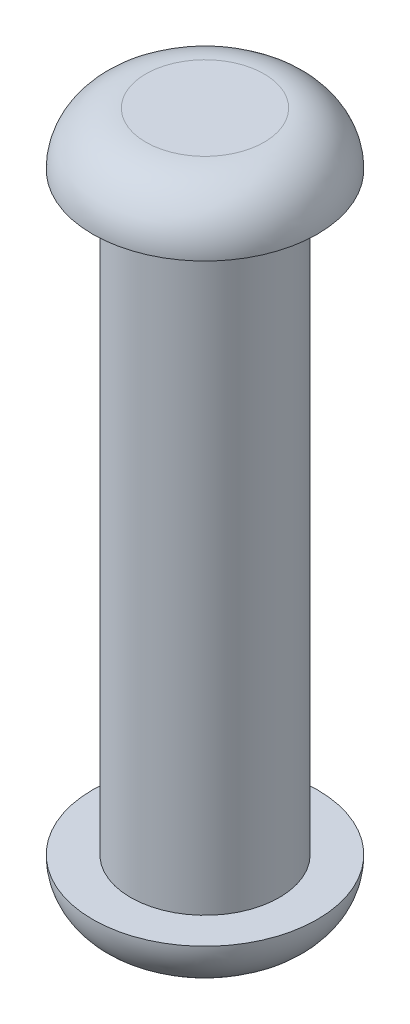
ISO-10303-21;
HEADER;
FILE_DESCRIPTION(('STEP AP214'),'2;1');
FILE_NAME('part.step','',(''),(''),'','','');
FILE_SCHEMA(('AUTOMOTIVE_DESIGN { 1 0 10303 214 1 1 1 1 }'));
ENDSEC;
DATA;
#1=APPLICATION_CONTEXT('core data for automotive mechanical design processes');
#2=APPLICATION_PROTOCOL_DEFINITION('international standard','automotive_design',2000,#1);
#3=PRODUCT_CONTEXT('',#1,'mechanical');
#4=PRODUCT('Part','Part','',(#3));
#5=PRODUCT_RELATED_PRODUCT_CATEGORY('part','',(#4));
#6=PRODUCT_DEFINITION_FORMATION('','',#4);
#7=PRODUCT_DEFINITION_CONTEXT('part definition',#1,'design');
#8=PRODUCT_DEFINITION('design','',#6,#7);
#9=PRODUCT_DEFINITION_SHAPE('','',#8);
#10=(LENGTH_UNIT() NAMED_UNIT(*) SI_UNIT(.MILLI.,.METRE.));
#11=(NAMED_UNIT(*) PLANE_ANGLE_UNIT() SI_UNIT($,.RADIAN.));
#12=(NAMED_UNIT(*) SI_UNIT($,.STERADIAN.) SOLID_ANGLE_UNIT());
#13=UNCERTAINTY_MEASURE_WITH_UNIT(LENGTH_MEASURE(1.E-05),#10,'distance_accuracy_value','');
#14=(GEOMETRIC_REPRESENTATION_CONTEXT(3) GLOBAL_UNCERTAINTY_ASSIGNED_CONTEXT((#13)) GLOBAL_UNIT_ASSIGNED_CONTEXT((#10,
#11,#12)) REPRESENTATION_CONTEXT('',''));
#15=CARTESIAN_POINT('',(0.,0.,0.));
#16=DIRECTION('',(0.,0.,1.));
#17=DIRECTION('',(1.,0.,0.));
#18=AXIS2_PLACEMENT_3D('',#15,#16,#17);
#19=CARTESIAN_POINT('',(0.,11.9095408163287,0.));
#20=DIRECTION('',(0.,-1.,0.));
#21=DIRECTION('',(0.,0.,-1.));
#22=AXIS2_PLACEMENT_3D('',#19,#20,#21);
#23=CYLINDRICAL_SURFACE('',#22,2.49500000000055);
#24=CARTESIAN_POINT('',(0.,11.9095408163287,0.));
#25=DIRECTION('',(0.,1.,0.));
#26=DIRECTION('',(0.,0.,1.));
#27=AXIS2_PLACEMENT_3D('',#24,#25,#26);
#28=CIRCLE('',#27,2.49500000000055);
#29=CARTESIAN_POINT('',(0.,11.9095408163287,2.49500000000055));
#30=VERTEX_POINT('',#29);
#31=EDGE_CURVE('E54',#30,#30,#28,.T.);
#32=ORIENTED_EDGE('',*,*,#31,.F.);
#33=EDGE_LOOP('',(#32));
#34=FACE_BOUND('',#33,.T.);
#35=CARTESIAN_POINT('',(0.,-7.99954081632873,0.));
#36=DIRECTION('',(0.,1.,0.));
#37=DIRECTION('',(0.,0.,1.));
#38=AXIS2_PLACEMENT_3D('',#35,#36,#37);
#39=CIRCLE('',#38,2.49500000000055);
#40=CARTESIAN_POINT('',(0.,-7.99954081632873,2.49500000000055));
#41=VERTEX_POINT('',#40);
#42=EDGE_CURVE('E63',#41,#41,#39,.T.);
#43=ORIENTED_EDGE('',*,*,#42,.T.);
#44=EDGE_LOOP('',(#43));
#45=FACE_BOUND('',#44,.T.);
#46=ADVANCED_FACE('F40',(#34,#45),#23,.T.);
#47=CARTESIAN_POINT('',(0.,13.691683673472,0.));
#48=DIRECTION('',(0.,1.,0.));
#49=DIRECTION('',(0.,0.,1.));
#50=AXIS2_PLACEMENT_3D('',#47,#48,#49);
#51=PLANE('',#50);
#52=CARTESIAN_POINT('',(0.,13.691683673472,0.));
#53=DIRECTION('',(0.,1.,0.));
#54=DIRECTION('',(0.,0.,1.));
#55=AXIS2_PLACEMENT_3D('',#52,#53,#54);
#56=CIRCLE('',#55,1.98581632653105);
#57=CARTESIAN_POINT('',(0.,13.691683673472,1.98581632653105));
#58=VERTEX_POINT('',#57);
#59=EDGE_CURVE('E48',#58,#58,#56,.T.);
#60=ORIENTED_EDGE('',*,*,#59,.T.);
#61=EDGE_LOOP('',(#60));
#62=FACE_BOUND('',#61,.T.);
#63=ADVANCED_FACE('F92',(#62),#51,.T.);
#64=CARTESIAN_POINT('',(0.,11.9095408163287,0.));
#65=DIRECTION('',(0.,1.,0.));
#66=DIRECTION('',(0.,0.,1.));
#67=AXIS2_PLACEMENT_3D('',#64,#65,#66);
#68=PLANE('',#67);
#69=ORIENTED_EDGE('',*,*,#31,.T.);
#70=EDGE_LOOP('',(#69));
#71=FACE_BOUND('',#70,.T.);
#72=CARTESIAN_POINT('',(0.,11.9095408163287,0.));
#73=DIRECTION('',(0.,1.,0.));
#74=DIRECTION('',(0.,0.,1.));
#75=AXIS2_PLACEMENT_3D('',#72,#73,#74);
#76=CIRCLE('',#75,3.7679591836743);
#77=CARTESIAN_POINT('',(0.,11.9095408163287,3.7679591836743));
#78=VERTEX_POINT('',#77);
#79=EDGE_CURVE('E60',#78,#78,#76,.T.);
#80=ORIENTED_EDGE('',*,*,#79,.F.);
#81=EDGE_LOOP('',(#80));
#82=FACE_BOUND('',#81,.T.);
#83=ADVANCED_FACE('F98',(#71,#82),#68,.F.);
#84=CARTESIAN_POINT('',(0.,11.9095408163287,0.));
#85=DIRECTION('',(0.,1.,0.));
#86=DIRECTION('',(0.,0.,1.));
#87=AXIS2_PLACEMENT_3D('',#84,#85,#86);
#88=TOROIDAL_SURFACE('',#87,1.98581632653105,1.78214285714325);
#89=ORIENTED_EDGE('',*,*,#79,.T.);
#90=EDGE_LOOP('',(#89));
#91=FACE_BOUND('',#90,.T.);
#92=ORIENTED_EDGE('',*,*,#59,.F.);
#93=EDGE_LOOP('',(#92));
#94=FACE_BOUND('',#93,.T.);
#95=ADVANCED_FACE('F87',(#91,#94),#88,.T.);
#96=CARTESIAN_POINT('',(0.,-9.78168367347198,0.));
#97=DIRECTION('',(0.,-1.,0.));
#98=DIRECTION('',(0.,0.,-1.));
#99=AXIS2_PLACEMENT_3D('',#96,#97,#98);
#100=PLANE('',#99);
#101=CARTESIAN_POINT('',(0.,-9.78168367347198,0.));
#102=DIRECTION('',(0.,-1.,0.));
#103=DIRECTION('',(0.,0.,-1.));
#104=AXIS2_PLACEMENT_3D('',#101,#102,#103);
#105=CIRCLE('',#104,1.98581632653105);
#106=CARTESIAN_POINT('',(0.,-9.78168367347198,-1.98581632653105));
#107=VERTEX_POINT('',#106);
#108=EDGE_CURVE('E10',#107,#107,#105,.T.);
#109=ORIENTED_EDGE('',*,*,#108,.T.);
#110=EDGE_LOOP('',(#109));
#111=FACE_BOUND('',#110,.T.);
#112=ADVANCED_FACE('F80',(#111),#100,.T.);
#113=CARTESIAN_POINT('',(0.,-7.99954081632873,0.));
#114=DIRECTION('',(0.,-1.,0.));
#115=DIRECTION('',(0.,0.,-1.));
#116=AXIS2_PLACEMENT_3D('',#113,#114,#115);
#117=PLANE('',#116);
#118=ORIENTED_EDGE('',*,*,#42,.F.);
#119=EDGE_LOOP('',(#118));
#120=FACE_BOUND('',#119,.T.);
#121=CARTESIAN_POINT('',(0.,-7.99954081632873,0.));
#122=DIRECTION('',(0.,-1.,0.));
#123=DIRECTION('',(0.,0.,-1.));
#124=AXIS2_PLACEMENT_3D('',#121,#122,#123);
#125=CIRCLE('',#124,3.7679591836743);
#126=CARTESIAN_POINT('',(0.,-7.99954081632873,-3.7679591836743));
#127=VERTEX_POINT('',#126);
#128=EDGE_CURVE('E66',#127,#127,#125,.T.);
#129=ORIENTED_EDGE('',*,*,#128,.F.);
#130=EDGE_LOOP('',(#129));
#131=FACE_BOUND('',#130,.T.);
#132=ADVANCED_FACE('F78',(#120,#131),#117,.F.);
#133=CARTESIAN_POINT('',(0.,-7.99954081632873,0.));
#134=DIRECTION('',(0.,-1.,0.));
#135=DIRECTION('',(0.,0.,-1.));
#136=AXIS2_PLACEMENT_3D('',#133,#134,#135);
#137=TOROIDAL_SURFACE('',#136,1.98581632653105,1.78214285714325);
#138=ORIENTED_EDGE('',*,*,#128,.T.);
#139=EDGE_LOOP('',(#138));
#140=FACE_BOUND('',#139,.T.);
#141=ORIENTED_EDGE('',*,*,#108,.F.);
#142=EDGE_LOOP('',(#141));
#143=FACE_BOUND('',#142,.T.);
#144=ADVANCED_FACE('F42',(#140,#143),#137,.T.);
#145=CLOSED_SHELL('',(#46,#63,#83,#95,#112,#132,#144));
#146=MANIFOLD_SOLID_BREP('B2',#145);
#147=ADVANCED_BREP_SHAPE_REPRESENTATION('',(#18,#146),#14);
#148=SHAPE_DEFINITION_REPRESENTATION(#9,#147);
ENDSEC;
END-ISO-10303-21;
